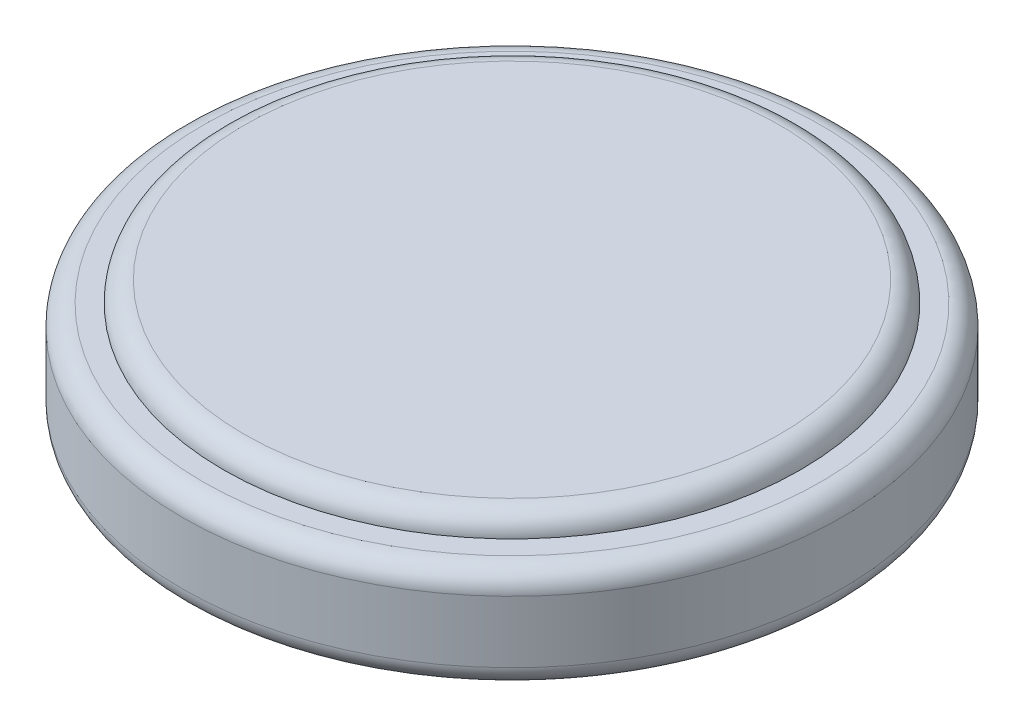
ISO-10303-21;
HEADER;
FILE_DESCRIPTION(('STEP AP214'),'2;1');
FILE_NAME('part.step','',(''),(''),'','','');
FILE_SCHEMA(('AUTOMOTIVE_DESIGN { 1 0 10303 214 1 1 1 1 }'));
ENDSEC;
DATA;
#1=APPLICATION_CONTEXT('core data for automotive mechanical design processes');
#2=APPLICATION_PROTOCOL_DEFINITION('international standard','automotive_design',2000,#1);
#3=PRODUCT_CONTEXT('',#1,'mechanical');
#4=PRODUCT('Part','Part','',(#3));
#5=PRODUCT_RELATED_PRODUCT_CATEGORY('part','',(#4));
#6=PRODUCT_DEFINITION_FORMATION('','',#4);
#7=PRODUCT_DEFINITION_CONTEXT('part definition',#1,'design');
#8=PRODUCT_DEFINITION('design','',#6,#7);
#9=PRODUCT_DEFINITION_SHAPE('','',#8);
#10=(LENGTH_UNIT() NAMED_UNIT(*) SI_UNIT(.MILLI.,.METRE.));
#11=(NAMED_UNIT(*) PLANE_ANGLE_UNIT() SI_UNIT($,.RADIAN.));
#12=(NAMED_UNIT(*) SI_UNIT($,.STERADIAN.) SOLID_ANGLE_UNIT());
#13=UNCERTAINTY_MEASURE_WITH_UNIT(LENGTH_MEASURE(1.E-05),#10,'distance_accuracy_value','');
#14=(GEOMETRIC_REPRESENTATION_CONTEXT(3) GLOBAL_UNCERTAINTY_ASSIGNED_CONTEXT((#13)) GLOBAL_UNIT_ASSIGNED_CONTEXT((#10,
#11,#12)) REPRESENTATION_CONTEXT('',''));
#15=CARTESIAN_POINT('',(0.,0.,0.));
#16=DIRECTION('',(0.,0.,1.));
#17=DIRECTION('',(1.,0.,0.));
#18=AXIS2_PLACEMENT_3D('',#15,#16,#17);
#19=CARTESIAN_POINT('',(0.,2.5,0.));
#20=DIRECTION('',(0.,-1.,0.));
#21=DIRECTION('',(0.,0.,-1.));
#22=AXIS2_PLACEMENT_3D('',#19,#20,#21);
#23=CYLINDRICAL_SURFACE('',#22,8.);
#24=CARTESIAN_POINT('',(0.,0.5,0.));
#25=DIRECTION('',(0.,1.,0.));
#26=DIRECTION('',(0.,0.,1.));
#27=AXIS2_PLACEMENT_3D('',#24,#25,#26);
#28=CIRCLE('',#27,8.);
#29=CARTESIAN_POINT('',(0.,0.5,8.));
#30=VERTEX_POINT('',#29);
#31=EDGE_CURVE('E46',#30,#30,#28,.T.);
#32=ORIENTED_EDGE('',*,*,#31,.T.);
#33=EDGE_LOOP('',(#32));
#34=FACE_BOUND('',#33,.T.);
#35=CARTESIAN_POINT('',(0.,2.,0.));
#36=DIRECTION('',(0.,1.,0.));
#37=DIRECTION('',(0.,0.,1.));
#38=AXIS2_PLACEMENT_3D('',#35,#36,#37);
#39=CIRCLE('',#38,8.);
#40=CARTESIAN_POINT('',(0.,2.,8.));
#41=VERTEX_POINT('',#40);
#42=EDGE_CURVE('E51',#41,#41,#39,.F.);
#43=ORIENTED_EDGE('',*,*,#42,.T.);
#44=EDGE_LOOP('',(#43));
#45=FACE_BOUND('',#44,.T.);
#46=ADVANCED_FACE('F31',(#34,#45),#23,.T.);
#47=CARTESIAN_POINT('',(0.,2.5,0.));
#48=DIRECTION('',(0.,1.,0.));
#49=DIRECTION('',(0.,0.,1.));
#50=AXIS2_PLACEMENT_3D('',#47,#48,#49);
#51=PLANE('',#50);
#52=CARTESIAN_POINT('',(0.,2.5,0.));
#53=DIRECTION('',(0.,1.,0.));
#54=DIRECTION('',(0.,0.,1.));
#55=AXIS2_PLACEMENT_3D('',#52,#53,#54);
#56=CIRCLE('',#55,7.5);
#57=CARTESIAN_POINT('',(0.,2.5,7.5));
#58=VERTEX_POINT('',#57);
#59=EDGE_CURVE('E38',#58,#58,#56,.T.);
#60=ORIENTED_EDGE('',*,*,#59,.T.);
#61=EDGE_LOOP('',(#60));
#62=FACE_BOUND('',#61,.T.);
#63=CARTESIAN_POINT('',(0.,2.5,0.));
#64=DIRECTION('',(0.,1.,0.));
#65=DIRECTION('',(0.,0.,1.));
#66=AXIS2_PLACEMENT_3D('',#63,#64,#65);
#67=CIRCLE('',#66,7.);
#68=CARTESIAN_POINT('',(0.,2.5,7.));
#69=VERTEX_POINT('',#68);
#70=EDGE_CURVE('E54',#69,#69,#67,.T.);
#71=ORIENTED_EDGE('',*,*,#70,.F.);
#72=EDGE_LOOP('',(#71));
#73=FACE_BOUND('',#72,.T.);
#74=ADVANCED_FACE('F60',(#62,#73),#51,.T.);
#75=CARTESIAN_POINT('',(0.,0.,0.));
#76=DIRECTION('',(0.,1.,0.));
#77=DIRECTION('',(0.,0.,1.));
#78=AXIS2_PLACEMENT_3D('',#75,#76,#77);
#79=PLANE('',#78);
#80=CARTESIAN_POINT('',(0.,0.,0.));
#81=DIRECTION('',(0.,1.,0.));
#82=DIRECTION('',(0.,0.,1.));
#83=AXIS2_PLACEMENT_3D('',#80,#81,#82);
#84=CIRCLE('',#83,7.5);
#85=CARTESIAN_POINT('',(0.,0.,7.5));
#86=VERTEX_POINT('',#85);
#87=EDGE_CURVE('E42',#86,#86,#84,.F.);
#88=ORIENTED_EDGE('',*,*,#87,.T.);
#89=EDGE_LOOP('',(#88));
#90=FACE_BOUND('',#89,.T.);
#91=ADVANCED_FACE('F62',(#90),#79,.F.);
#92=CARTESIAN_POINT('',(0.,3.,0.));
#93=DIRECTION('',(0.,1.,0.));
#94=DIRECTION('',(0.,0.,1.));
#95=AXIS2_PLACEMENT_3D('',#92,#93,#94);
#96=PLANE('',#95);
#97=CARTESIAN_POINT('',(0.,3.,0.));
#98=DIRECTION('',(0.,1.,0.));
#99=DIRECTION('',(0.,0.,1.));
#100=AXIS2_PLACEMENT_3D('',#97,#98,#99);
#101=CIRCLE('',#100,6.5);
#102=CARTESIAN_POINT('',(0.,3.,6.5));
#103=VERTEX_POINT('',#102);
#104=EDGE_CURVE('E10',#103,#103,#101,.T.);
#105=ORIENTED_EDGE('',*,*,#104,.T.);
#106=EDGE_LOOP('',(#105));
#107=FACE_BOUND('',#106,.T.);
#108=ADVANCED_FACE('F68',(#107),#96,.T.);
#109=CARTESIAN_POINT('',(0.,0.5,0.));
#110=DIRECTION('',(0.,1.,0.));
#111=DIRECTION('',(0.,0.,1.));
#112=AXIS2_PLACEMENT_3D('',#109,#110,#111);
#113=TOROIDAL_SURFACE('',#112,7.5,0.5);
#114=ORIENTED_EDGE('',*,*,#87,.F.);
#115=EDGE_LOOP('',(#114));
#116=FACE_BOUND('',#115,.T.);
#117=ORIENTED_EDGE('',*,*,#31,.F.);
#118=EDGE_LOOP('',(#117));
#119=FACE_BOUND('',#118,.T.);
#120=ADVANCED_FACE('F75',(#116,#119),#113,.T.);
#121=CARTESIAN_POINT('',(0.,2.,0.));
#122=DIRECTION('',(0.,1.,0.));
#123=DIRECTION('',(0.,0.,1.));
#124=AXIS2_PLACEMENT_3D('',#121,#122,#123);
#125=TOROIDAL_SURFACE('',#124,7.5,0.5);
#126=ORIENTED_EDGE('',*,*,#42,.F.);
#127=EDGE_LOOP('',(#126));
#128=FACE_BOUND('',#127,.T.);
#129=ORIENTED_EDGE('',*,*,#59,.F.);
#130=EDGE_LOOP('',(#129));
#131=FACE_BOUND('',#130,.T.);
#132=ADVANCED_FACE('F77',(#128,#131),#125,.T.);
#133=CARTESIAN_POINT('',(0.,2.5,0.));
#134=DIRECTION('',(0.,1.,0.));
#135=DIRECTION('',(0.,0.,1.));
#136=AXIS2_PLACEMENT_3D('',#133,#134,#135);
#137=TOROIDAL_SURFACE('',#136,6.5,0.5);
#138=ORIENTED_EDGE('',*,*,#70,.T.);
#139=EDGE_LOOP('',(#138));
#140=FACE_BOUND('',#139,.T.);
#141=ORIENTED_EDGE('',*,*,#104,.F.);
#142=EDGE_LOOP('',(#141));
#143=FACE_BOUND('',#142,.T.);
#144=ADVANCED_FACE('F33',(#140,#143),#137,.T.);
#145=CLOSED_SHELL('',(#46,#74,#91,#108,#120,#132,#144));
#146=MANIFOLD_SOLID_BREP('B2',#145);
#147=ADVANCED_BREP_SHAPE_REPRESENTATION('',(#18,#146),#14);
#148=SHAPE_DEFINITION_REPRESENTATION(#9,#147);
ENDSEC;
END-ISO-10303-21;
